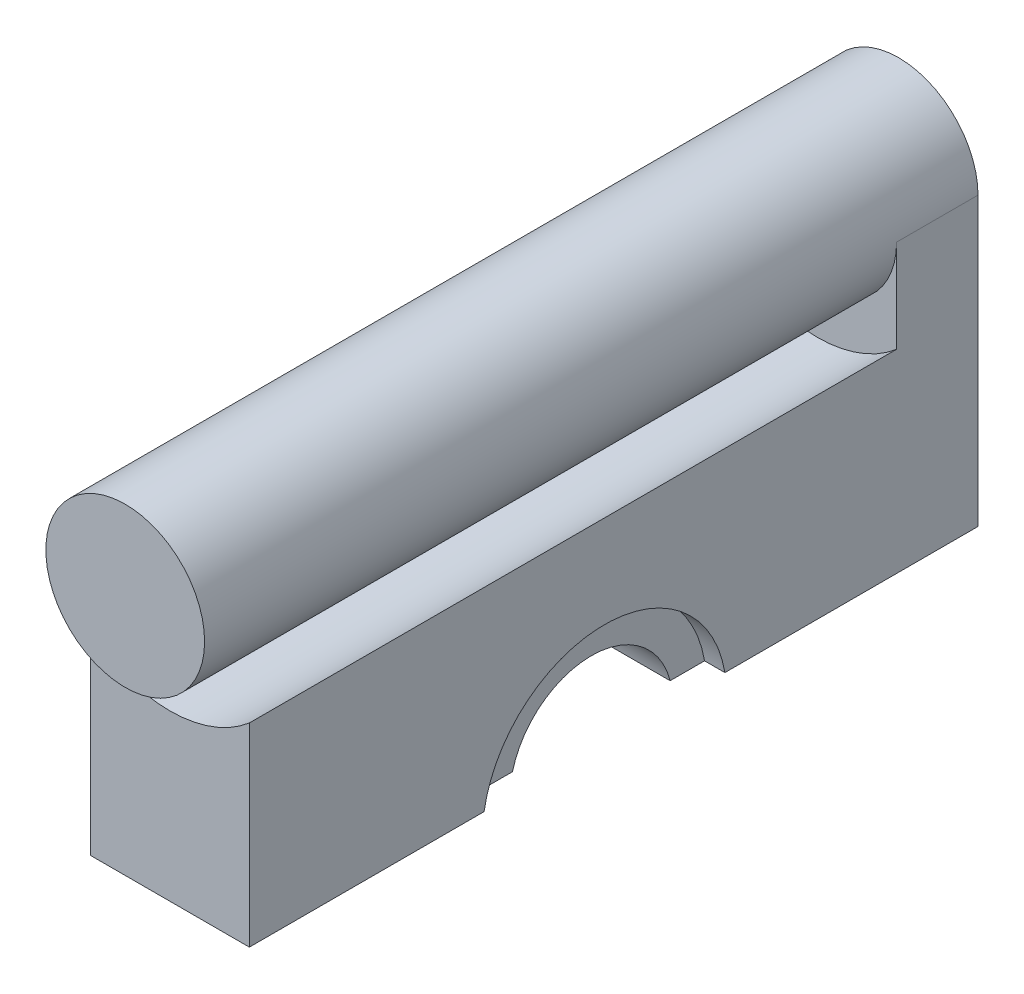
ISO-10303-21;
HEADER;
FILE_DESCRIPTION(('STEP AP214'),'2;1');
FILE_NAME('part.step','',(''),(''),'','','');
FILE_SCHEMA(('AUTOMOTIVE_DESIGN { 1 0 10303 214 1 1 1 1 }'));
ENDSEC;
DATA;
#1=APPLICATION_CONTEXT('core data for automotive mechanical design processes');
#2=APPLICATION_PROTOCOL_DEFINITION('international standard','automotive_design',2000,#1);
#3=PRODUCT_CONTEXT('',#1,'mechanical');
#4=PRODUCT('Part','Part','',(#3));
#5=PRODUCT_RELATED_PRODUCT_CATEGORY('part','',(#4));
#6=PRODUCT_DEFINITION_FORMATION('','',#4);
#7=PRODUCT_DEFINITION_CONTEXT('part definition',#1,'design');
#8=PRODUCT_DEFINITION('design','',#6,#7);
#9=PRODUCT_DEFINITION_SHAPE('','',#8);
#10=(LENGTH_UNIT() NAMED_UNIT(*) SI_UNIT(.MILLI.,.METRE.));
#11=(NAMED_UNIT(*) PLANE_ANGLE_UNIT() SI_UNIT($,.RADIAN.));
#12=(NAMED_UNIT(*) SI_UNIT($,.STERADIAN.) SOLID_ANGLE_UNIT());
#13=UNCERTAINTY_MEASURE_WITH_UNIT(LENGTH_MEASURE(1.E-05),#10,'distance_accuracy_value','');
#14=(GEOMETRIC_REPRESENTATION_CONTEXT(3) GLOBAL_UNCERTAINTY_ASSIGNED_CONTEXT((#13)) GLOBAL_UNIT_ASSIGNED_CONTEXT((#10,
#11,#12)) REPRESENTATION_CONTEXT('',''));
#15=CARTESIAN_POINT('',(0.,0.,0.));
#16=DIRECTION('',(0.,0.,1.));
#17=DIRECTION('',(1.,0.,0.));
#18=AXIS2_PLACEMENT_3D('',#15,#16,#17);
#19=CARTESIAN_POINT('',(15.05,-7.55,9.));
#20=DIRECTION('',(-1.,0.,0.));
#21=DIRECTION('',(0.,0.,1.));
#22=AXIS2_PLACEMENT_3D('',#19,#20,#21);
#23=CYLINDRICAL_SURFACE('',#22,2.);
#24=CARTESIAN_POINT('',(1.45,-7.55,9.));
#25=DIRECTION('',(1.,0.,0.));
#26=DIRECTION('',(0.,0.,-1.));
#27=AXIS2_PLACEMENT_3D('',#24,#25,#26);
#28=CIRCLE('',#27,2.);
#29=CARTESIAN_POINT('',(1.45,-7.05,10.9364916731037));
#30=VERTEX_POINT('',#29);
#31=CARTESIAN_POINT('',(1.45,-7.05,7.06350832689629));
#32=VERTEX_POINT('',#31);
#33=EDGE_CURVE('E68',#30,#32,#28,.F.);
#34=ORIENTED_EDGE('',*,*,#33,.F.);
#35=DIRECTION('',(-1.,0.,0.));
#36=VECTOR('',#35,1.);
#37=CARTESIAN_POINT('',(15.05,-7.05,10.9364916731037));
#38=LINE('',#37,#36);
#39=CARTESIAN_POINT('',(-1.95,-7.05,10.9364916731037));
#40=VERTEX_POINT('',#39);
#41=EDGE_CURVE('E197',#40,#30,#38,.F.);
#42=ORIENTED_EDGE('',*,*,#41,.F.);
#43=CARTESIAN_POINT('',(-1.95,-7.55,9.));
#44=DIRECTION('',(-1.,0.,0.));
#45=DIRECTION('',(0.,0.,1.));
#46=AXIS2_PLACEMENT_3D('',#43,#44,#45);
#47=CIRCLE('',#46,2.);
#48=CARTESIAN_POINT('',(-1.95,-7.05,7.06350832689629));
#49=VERTEX_POINT('',#48);
#50=EDGE_CURVE('E149',#40,#49,#47,.T.);
#51=ORIENTED_EDGE('',*,*,#50,.T.);
#52=DIRECTION('',(-1.,0.,0.));
#53=VECTOR('',#52,1.);
#54=CARTESIAN_POINT('',(15.05,-7.05,7.06350832689629));
#55=LINE('',#54,#53);
#56=EDGE_CURVE('E201',#32,#49,#55,.T.);
#57=ORIENTED_EDGE('',*,*,#56,.F.);
#58=EDGE_LOOP('',(#34,#42,#51,#57));
#59=FACE_BOUND('',#58,.T.);
#60=ADVANCED_FACE('F59',(#59),#23,.F.);
#61=CARTESIAN_POINT('',(1.95,-7.05,2.));
#62=DIRECTION('',(0.,1.,0.));
#63=DIRECTION('',(0.,0.,1.));
#64=AXIS2_PLACEMENT_3D('',#61,#62,#63);
#65=PLANE('',#64);
#66=DIRECTION('',(0.,0.,-1.));
#67=VECTOR('',#66,1.);
#68=CARTESIAN_POINT('',(1.95,-7.05,2.));
#69=LINE('',#68,#67);
#70=CARTESIAN_POINT('',(1.95,-7.05,6.21801897089739));
#71=VERTEX_POINT('',#70);
#72=CARTESIAN_POINT('',(1.95,-7.05,0.));
#73=VERTEX_POINT('',#72);
#74=EDGE_CURVE('E154',#71,#73,#69,.T.);
#75=ORIENTED_EDGE('',*,*,#74,.F.);
#76=DIRECTION('',(1.,0.,0.));
#77=VECTOR('',#76,1.);
#78=CARTESIAN_POINT('',(1.45,-7.05,6.21801897089739));
#79=LINE('',#78,#77);
#80=CARTESIAN_POINT('',(1.45,-7.05,6.21801897089739));
#81=VERTEX_POINT('',#80);
#82=EDGE_CURVE('E140',#71,#81,#79,.F.);
#83=ORIENTED_EDGE('',*,*,#82,.T.);
#84=DIRECTION('',(0.,0.,-1.));
#85=VECTOR('',#84,1.);
#86=CARTESIAN_POINT('',(1.45,-7.05,2.));
#87=LINE('',#86,#85);
#88=EDGE_CURVE('E150',#32,#81,#87,.T.);
#89=ORIENTED_EDGE('',*,*,#88,.F.);
#90=ORIENTED_EDGE('',*,*,#56,.T.);
#91=DIRECTION('',(0.,0.,-1.));
#92=VECTOR('',#91,1.);
#93=CARTESIAN_POINT('',(-1.95,-7.05,2.));
#94=LINE('',#93,#92);
#95=CARTESIAN_POINT('',(-1.95,-7.05,0.));
#96=VERTEX_POINT('',#95);
#97=EDGE_CURVE('E182',#49,#96,#94,.T.);
#98=ORIENTED_EDGE('',*,*,#97,.T.);
#99=DIRECTION('',(-1.,0.,0.));
#100=VECTOR('',#99,1.);
#101=CARTESIAN_POINT('',(1.95,-7.05,0.));
#102=LINE('',#101,#100);
#103=EDGE_CURVE('E162',#73,#96,#102,.T.);
#104=ORIENTED_EDGE('',*,*,#103,.F.);
#105=EDGE_LOOP('',(#75,#83,#89,#90,#98,#104));
#106=FACE_BOUND('',#105,.T.);
#107=ADVANCED_FACE('F160',(#106),#65,.F.);
#108=CARTESIAN_POINT('',(0.,0.,0.));
#109=DIRECTION('',(0.,0.,1.));
#110=DIRECTION('',(1.,0.,0.));
#111=AXIS2_PLACEMENT_3D('',#108,#109,#110);
#112=PLANE('',#111);
#113=CARTESIAN_POINT('',(0.,0.,0.));
#114=DIRECTION('',(0.,0.,1.));
#115=DIRECTION('',(1.,0.,0.));
#116=AXIS2_PLACEMENT_3D('',#113,#114,#115);
#117=CIRCLE('',#116,1.95);
#118=CARTESIAN_POINT('',(1.95,0.,0.));
#119=VERTEX_POINT('',#118);
#120=CARTESIAN_POINT('',(-1.95,0.,0.));
#121=VERTEX_POINT('',#120);
#122=EDGE_CURVE('E223',#119,#121,#117,.T.);
#123=ORIENTED_EDGE('',*,*,#122,.F.);
#124=DIRECTION('',(0.,1.,0.));
#125=VECTOR('',#124,1.);
#126=CARTESIAN_POINT('',(1.95,1.95,0.));
#127=LINE('',#126,#125);
#128=EDGE_CURVE('E169',#73,#119,#127,.T.);
#129=ORIENTED_EDGE('',*,*,#128,.F.);
#130=ORIENTED_EDGE('',*,*,#103,.T.);
#131=DIRECTION('',(0.,1.,0.));
#132=VECTOR('',#131,1.);
#133=CARTESIAN_POINT('',(-1.95,1.95,0.));
#134=LINE('',#133,#132);
#135=EDGE_CURVE('E173',#96,#121,#134,.T.);
#136=ORIENTED_EDGE('',*,*,#135,.T.);
#137=EDGE_LOOP('',(#123,#129,#130,#136));
#138=FACE_BOUND('',#137,.T.);
#139=ADVANCED_FACE('F257',(#138),#112,.F.);
#140=CARTESIAN_POINT('',(1.95,0.,0.));
#141=DIRECTION('',(1.,0.,0.));
#142=DIRECTION('',(0.,0.,-1.));
#143=AXIS2_PLACEMENT_3D('',#140,#141,#142);
#144=PLANE('',#143);
#145=CARTESIAN_POINT('',(1.95,-7.55,9.17605886244719));
#146=DIRECTION('',(1.,0.,0.));
#147=DIRECTION('',(0.,0.,-1.));
#148=AXIS2_PLACEMENT_3D('',#145,#146,#147);
#149=CIRCLE('',#148,3.);
#150=CARTESIAN_POINT('',(1.95,-7.05,12.134098753997));
#151=VERTEX_POINT('',#150);
#152=EDGE_CURVE('E143',#71,#151,#149,.T.);
#153=ORIENTED_EDGE('',*,*,#152,.F.);
#154=ORIENTED_EDGE('',*,*,#74,.T.);
#155=ORIENTED_EDGE('',*,*,#128,.T.);
#156=DIRECTION('',(0.,0.,1.));
#157=VECTOR('',#156,1.);
#158=CARTESIAN_POINT('',(1.95,0.,0.));
#159=LINE('',#158,#157);
#160=CARTESIAN_POINT('',(1.95,0.,2.));
#161=VERTEX_POINT('',#160);
#162=EDGE_CURVE('E83',#119,#161,#159,.T.);
#163=ORIENTED_EDGE('',*,*,#162,.T.);
#164=DIRECTION('',(0.,-1.,0.));
#165=VECTOR('',#164,1.);
#166=CARTESIAN_POINT('',(1.95,1.95,2.));
#167=LINE('',#166,#165);
#168=CARTESIAN_POINT('',(1.95,-2.2798026230356,2.));
#169=VERTEX_POINT('',#168);
#170=EDGE_CURVE('E165',#161,#169,#167,.T.);
#171=ORIENTED_EDGE('',*,*,#170,.T.);
#172=DIRECTION('',(0.,0.,-1.));
#173=VECTOR('',#172,1.);
#174=CARTESIAN_POINT('',(1.95,-2.2798026230356,17.9));
#175=LINE('',#174,#173);
#176=CARTESIAN_POINT('',(1.95,-2.2798026230356,17.9));
#177=VERTEX_POINT('',#176);
#178=EDGE_CURVE('E231',#177,#169,#175,.T.);
#179=ORIENTED_EDGE('',*,*,#178,.F.);
#180=DIRECTION('',(0.,1.,0.));
#181=VECTOR('',#180,1.);
#182=CARTESIAN_POINT('',(1.95,0.,17.9));
#183=LINE('',#182,#181);
#184=CARTESIAN_POINT('',(1.95,-7.05,17.9));
#185=VERTEX_POINT('',#184);
#186=EDGE_CURVE('E234',#185,#177,#183,.T.);
#187=ORIENTED_EDGE('',*,*,#186,.F.);
#188=EDGE_CURVE('E157',#185,#151,#69,.T.);
#189=ORIENTED_EDGE('',*,*,#188,.T.);
#190=EDGE_LOOP('',(#153,#154,#155,#163,#171,#179,#187,#189));
#191=FACE_BOUND('',#190,.T.);
#192=ADVANCED_FACE('F153',(#191),#144,.T.);
#193=CARTESIAN_POINT('',(-1.95,0.,0.));
#194=DIRECTION('',(1.,0.,0.));
#195=DIRECTION('',(0.,0.,-1.));
#196=AXIS2_PLACEMENT_3D('',#193,#194,#195);
#197=PLANE('',#196);
#198=ORIENTED_EDGE('',*,*,#97,.F.);
#199=ORIENTED_EDGE('',*,*,#50,.F.);
#200=CARTESIAN_POINT('',(-1.95,-7.05,17.9));
#201=VERTEX_POINT('',#200);
#202=EDGE_CURVE('E183',#201,#40,#94,.T.);
#203=ORIENTED_EDGE('',*,*,#202,.F.);
#204=DIRECTION('',(0.,-1.,0.));
#205=VECTOR('',#204,1.);
#206=CARTESIAN_POINT('',(-1.95,0.,17.9));
#207=LINE('',#206,#205);
#208=CARTESIAN_POINT('',(-1.95,-2.2798026230356,17.9));
#209=VERTEX_POINT('',#208);
#210=EDGE_CURVE('E241',#209,#201,#207,.T.);
#211=ORIENTED_EDGE('',*,*,#210,.F.);
#212=DIRECTION('',(0.,0.,-1.));
#213=VECTOR('',#212,1.);
#214=CARTESIAN_POINT('',(-1.95,-2.2798026230356,17.9));
#215=LINE('',#214,#213);
#216=CARTESIAN_POINT('',(-1.95,-2.2798026230356,2.));
#217=VERTEX_POINT('',#216);
#218=EDGE_CURVE('E228',#209,#217,#215,.T.);
#219=ORIENTED_EDGE('',*,*,#218,.T.);
#220=DIRECTION('',(0.,-1.,0.));
#221=VECTOR('',#220,1.);
#222=CARTESIAN_POINT('',(-1.95,1.95,2.));
#223=LINE('',#222,#221);
#224=CARTESIAN_POINT('',(-1.95,0.,2.));
#225=VERTEX_POINT('',#224);
#226=EDGE_CURVE('E177',#225,#217,#223,.T.);
#227=ORIENTED_EDGE('',*,*,#226,.F.);
#228=DIRECTION('',(0.,0.,1.));
#229=VECTOR('',#228,1.);
#230=CARTESIAN_POINT('',(-1.95,0.,0.));
#231=LINE('',#230,#229);
#232=EDGE_CURVE('E178',#121,#225,#231,.T.);
#233=ORIENTED_EDGE('',*,*,#232,.F.);
#234=ORIENTED_EDGE('',*,*,#135,.F.);
#235=EDGE_LOOP('',(#198,#199,#203,#211,#219,#227,#233,#234));
#236=FACE_BOUND('',#235,.T.);
#237=ADVANCED_FACE('F217',(#236),#197,.F.);
#238=CARTESIAN_POINT('',(0.,0.,19.));
#239=DIRECTION('',(0.,0.,-1.));
#240=DIRECTION('',(-1.,0.,0.));
#241=AXIS2_PLACEMENT_3D('',#238,#239,#240);
#242=CYLINDRICAL_SURFACE('',#241,1.95);
#243=CARTESIAN_POINT('',(0.,0.,2.));
#244=DIRECTION('',(0.,0.,-1.));
#245=DIRECTION('',(0.,1.,0.));
#246=AXIS2_PLACEMENT_3D('',#243,#244,#245);
#247=CIRCLE('',#246,1.95);
#248=EDGE_CURVE('E193',#161,#225,#247,.T.);
#249=ORIENTED_EDGE('',*,*,#248,.F.);
#250=ORIENTED_EDGE('',*,*,#162,.F.);
#251=ORIENTED_EDGE('',*,*,#122,.T.);
#252=ORIENTED_EDGE('',*,*,#232,.T.);
#253=EDGE_LOOP('',(#249,#250,#251,#252));
#254=FACE_BOUND('',#253,.T.);
#255=CARTESIAN_POINT('',(0.,0.,19.));
#256=DIRECTION('',(0.,0.,1.));
#257=DIRECTION('',(1.,0.,0.));
#258=AXIS2_PLACEMENT_3D('',#255,#256,#257);
#259=CIRCLE('',#258,1.95);
#260=CARTESIAN_POINT('',(1.95,0.,19.));
#261=VERTEX_POINT('',#260);
#262=EDGE_CURVE('E189',#261,#261,#259,.T.);
#263=ORIENTED_EDGE('',*,*,#262,.F.);
#264=EDGE_LOOP('',(#263));
#265=FACE_BOUND('',#264,.T.);
#266=ADVANCED_FACE('F61',(#254,#265),#242,.T.);
#267=CARTESIAN_POINT('',(0.,0.,19.));
#268=DIRECTION('',(0.,0.,1.));
#269=DIRECTION('',(1.,0.,0.));
#270=AXIS2_PLACEMENT_3D('',#267,#268,#269);
#271=PLANE('',#270);
#272=ORIENTED_EDGE('',*,*,#262,.T.);
#273=EDGE_LOOP('',(#272));
#274=FACE_BOUND('',#273,.T.);
#275=ADVANCED_FACE('F282',(#274),#271,.T.);
#276=CARTESIAN_POINT('',(1.95,1.95,2.));
#277=DIRECTION('',(0.,0.,-1.));
#278=DIRECTION('',(0.,1.,0.));
#279=AXIS2_PLACEMENT_3D('',#276,#277,#278);
#280=PLANE('',#279);
#281=ORIENTED_EDGE('',*,*,#226,.T.);
#282=CARTESIAN_POINT('',(0.,0.,2.));
#283=DIRECTION('',(0.,0.,1.));
#284=DIRECTION('',(1.,0.,0.));
#285=AXIS2_PLACEMENT_3D('',#282,#283,#284);
#286=CIRCLE('',#285,3.);
#287=EDGE_CURVE('E214',#217,#169,#286,.T.);
#288=ORIENTED_EDGE('',*,*,#287,.T.);
#289=ORIENTED_EDGE('',*,*,#170,.F.);
#290=ORIENTED_EDGE('',*,*,#248,.T.);
#291=EDGE_LOOP('',(#281,#288,#289,#290));
#292=FACE_BOUND('',#291,.T.);
#293=ADVANCED_FACE('F263',(#292),#280,.F.);
#294=DIRECTION('',(0.,0.,-1.));
#295=VECTOR('',#294,1.);
#296=CARTESIAN_POINT('',(1.45,-7.05,2.));
#297=LINE('',#296,#295);
#298=CARTESIAN_POINT('',(1.45,-7.05,12.134098753997));
#299=VERTEX_POINT('',#298);
#300=EDGE_CURVE('E75',#299,#30,#297,.T.);
#301=ORIENTED_EDGE('',*,*,#300,.F.);
#302=DIRECTION('',(1.,0.,0.));
#303=VECTOR('',#302,1.);
#304=CARTESIAN_POINT('',(1.45,-7.05,12.134098753997));
#305=LINE('',#304,#303);
#306=EDGE_CURVE('E12',#299,#151,#305,.T.);
#307=ORIENTED_EDGE('',*,*,#306,.T.);
#308=ORIENTED_EDGE('',*,*,#188,.F.);
#309=DIRECTION('',(1.,0.,0.));
#310=VECTOR('',#309,1.);
#311=CARTESIAN_POINT('',(0.,-7.05,17.9));
#312=LINE('',#311,#310);
#313=EDGE_CURVE('E237',#201,#185,#312,.T.);
#314=ORIENTED_EDGE('',*,*,#313,.F.);
#315=ORIENTED_EDGE('',*,*,#202,.T.);
#316=ORIENTED_EDGE('',*,*,#41,.T.);
#317=EDGE_LOOP('',(#301,#307,#308,#314,#315,#316));
#318=FACE_BOUND('',#317,.T.);
#319=ADVANCED_FACE('F274',(#318),#65,.F.);
#320=CARTESIAN_POINT('',(0.,0.,17.9));
#321=DIRECTION('',(0.,0.,-1.));
#322=DIRECTION('',(-1.,0.,0.));
#323=AXIS2_PLACEMENT_3D('',#320,#321,#322);
#324=CYLINDRICAL_SURFACE('',#323,3.);
#325=ORIENTED_EDGE('',*,*,#287,.F.);
#326=ORIENTED_EDGE('',*,*,#218,.F.);
#327=CARTESIAN_POINT('',(0.,0.,17.9));
#328=DIRECTION('',(0.,0.,1.));
#329=DIRECTION('',(1.,0.,0.));
#330=AXIS2_PLACEMENT_3D('',#327,#328,#329);
#331=CIRCLE('',#330,3.);
#332=EDGE_CURVE('E245',#209,#177,#331,.T.);
#333=ORIENTED_EDGE('',*,*,#332,.T.);
#334=ORIENTED_EDGE('',*,*,#178,.T.);
#335=EDGE_LOOP('',(#325,#326,#333,#334));
#336=FACE_BOUND('',#335,.T.);
#337=ADVANCED_FACE('F268',(#336),#324,.F.);
#338=CARTESIAN_POINT('',(0.,0.,17.9));
#339=DIRECTION('',(0.,0.,1.));
#340=DIRECTION('',(1.,0.,0.));
#341=AXIS2_PLACEMENT_3D('',#338,#339,#340);
#342=PLANE('',#341);
#343=ORIENTED_EDGE('',*,*,#332,.F.);
#344=ORIENTED_EDGE('',*,*,#210,.T.);
#345=ORIENTED_EDGE('',*,*,#313,.T.);
#346=ORIENTED_EDGE('',*,*,#186,.T.);
#347=EDGE_LOOP('',(#343,#344,#345,#346));
#348=FACE_BOUND('',#347,.T.);
#349=ADVANCED_FACE('F271',(#348),#342,.T.);
#350=CARTESIAN_POINT('',(1.45,-7.55,9.17605886244719));
#351=DIRECTION('',(1.,0.,0.));
#352=DIRECTION('',(0.,0.,-1.));
#353=AXIS2_PLACEMENT_3D('',#350,#351,#352);
#354=CYLINDRICAL_SURFACE('',#353,3.);
#355=ORIENTED_EDGE('',*,*,#152,.T.);
#356=ORIENTED_EDGE('',*,*,#306,.F.);
#357=CARTESIAN_POINT('',(1.45,-7.55,9.17605886244719));
#358=DIRECTION('',(1.,0.,0.));
#359=DIRECTION('',(0.,0.,-1.));
#360=AXIS2_PLACEMENT_3D('',#357,#358,#359);
#361=CIRCLE('',#360,3.);
#362=EDGE_CURVE('E144',#81,#299,#361,.T.);
#363=ORIENTED_EDGE('',*,*,#362,.F.);
#364=ORIENTED_EDGE('',*,*,#82,.F.);
#365=EDGE_LOOP('',(#355,#356,#363,#364));
#366=FACE_BOUND('',#365,.T.);
#367=ADVANCED_FACE('F142',(#366),#354,.F.);
#368=CARTESIAN_POINT('',(1.45,-7.55,9.17605886244719));
#369=DIRECTION('',(1.,0.,0.));
#370=DIRECTION('',(0.,0.,-1.));
#371=AXIS2_PLACEMENT_3D('',#368,#369,#370);
#372=PLANE('',#371);
#373=ORIENTED_EDGE('',*,*,#88,.T.);
#374=ORIENTED_EDGE('',*,*,#362,.T.);
#375=ORIENTED_EDGE('',*,*,#300,.T.);
#376=ORIENTED_EDGE('',*,*,#33,.T.);
#377=EDGE_LOOP('',(#373,#374,#375,#376));
#378=FACE_BOUND('',#377,.T.);
#379=ADVANCED_FACE('F204',(#378),#372,.T.);
#380=CLOSED_SHELL('',(#60,#107,#139,#192,#237,#266,#275,#293,#319,#337,#349,#367,#379));
#381=MANIFOLD_SOLID_BREP('B2',#380);
#382=ADVANCED_BREP_SHAPE_REPRESENTATION('',(#18,#381),#14);
#383=SHAPE_DEFINITION_REPRESENTATION(#9,#382);
ENDSEC;
END-ISO-10303-21;
